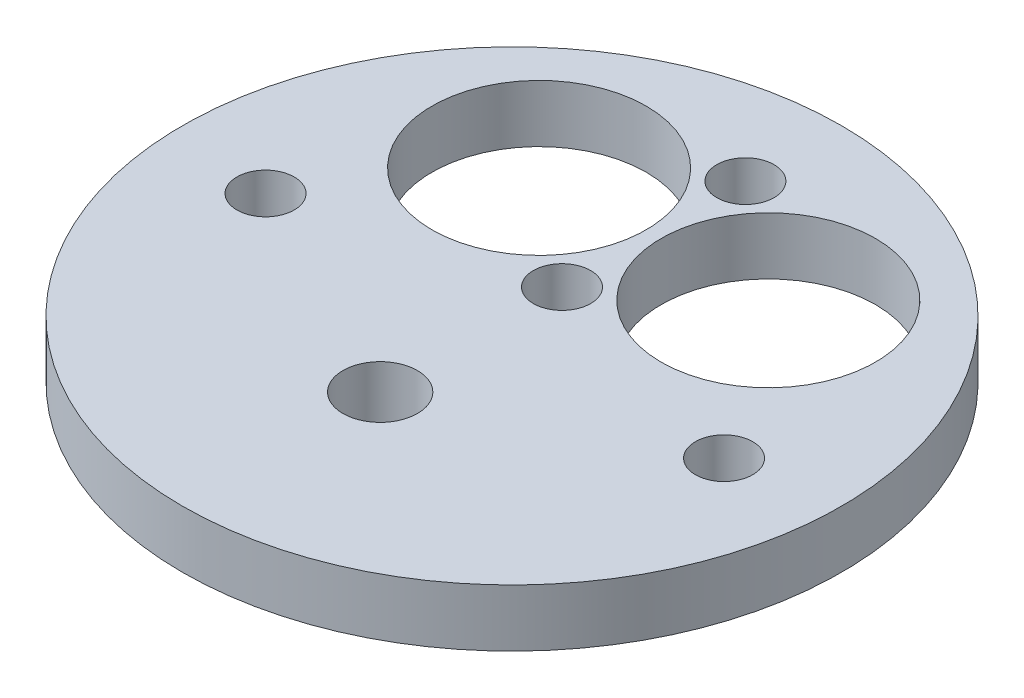
ISO-10303-21;
HEADER;
FILE_DESCRIPTION(('STEP AP214'),'2;1');
FILE_NAME('part.step','',(''),(''),'','','');
FILE_SCHEMA(('AUTOMOTIVE_DESIGN { 1 0 10303 214 1 1 1 1 }'));
ENDSEC;
DATA;
#1=APPLICATION_CONTEXT('core data for automotive mechanical design processes');
#2=APPLICATION_PROTOCOL_DEFINITION('international standard','automotive_design',2000,#1);
#3=PRODUCT_CONTEXT('',#1,'mechanical');
#4=PRODUCT('Part','Part','',(#3));
#5=PRODUCT_RELATED_PRODUCT_CATEGORY('part','',(#4));
#6=PRODUCT_DEFINITION_FORMATION('','',#4);
#7=PRODUCT_DEFINITION_CONTEXT('part definition',#1,'design');
#8=PRODUCT_DEFINITION('design','',#6,#7);
#9=PRODUCT_DEFINITION_SHAPE('','',#8);
#10=(LENGTH_UNIT() NAMED_UNIT(*) SI_UNIT(.MILLI.,.METRE.));
#11=(NAMED_UNIT(*) PLANE_ANGLE_UNIT() SI_UNIT($,.RADIAN.));
#12=(NAMED_UNIT(*) SI_UNIT($,.STERADIAN.) SOLID_ANGLE_UNIT());
#13=UNCERTAINTY_MEASURE_WITH_UNIT(LENGTH_MEASURE(1.E-05),#10,'distance_accuracy_value','');
#14=(GEOMETRIC_REPRESENTATION_CONTEXT(3) GLOBAL_UNCERTAINTY_ASSIGNED_CONTEXT((#13)) GLOBAL_UNIT_ASSIGNED_CONTEXT((#10,
#11,#12)) REPRESENTATION_CONTEXT('',''));
#15=CARTESIAN_POINT('',(0.,0.,0.));
#16=DIRECTION('',(0.,0.,1.));
#17=DIRECTION('',(1.,0.,0.));
#18=AXIS2_PLACEMENT_3D('',#15,#16,#17);
#19=CARTESIAN_POINT('',(0.,0.,0.));
#20=DIRECTION('',(0.,-1.,0.));
#21=DIRECTION('',(0.,0.,-1.));
#22=AXIS2_PLACEMENT_3D('',#19,#20,#21);
#23=PLANE('',#22);
#24=CARTESIAN_POINT('',(-25.4,0.,1.905));
#25=DIRECTION('',(0.,1.,0.));
#26=DIRECTION('',(0.,0.,1.));
#27=AXIS2_PLACEMENT_3D('',#24,#25,#26);
#28=CIRCLE('',#27,3.175);
#29=CARTESIAN_POINT('',(-25.4,0.,5.08));
#30=VERTEX_POINT('',#29);
#31=EDGE_CURVE('E120',#30,#30,#28,.T.);
#32=ORIENTED_EDGE('',*,*,#31,.T.);
#33=EDGE_LOOP('',(#32));
#34=FACE_BOUND('',#33,.T.);
#35=CARTESIAN_POINT('',(25.4,0.,1.90499999999999));
#36=DIRECTION('',(0.,1.,0.));
#37=DIRECTION('',(0.,0.,1.));
#38=AXIS2_PLACEMENT_3D('',#35,#36,#37);
#39=CIRCLE('',#38,3.175);
#40=CARTESIAN_POINT('',(25.4,0.,5.07999999999999));
#41=VERTEX_POINT('',#40);
#42=EDGE_CURVE('E124',#41,#41,#39,.T.);
#43=ORIENTED_EDGE('',*,*,#42,.T.);
#44=EDGE_LOOP('',(#43));
#45=FACE_BOUND('',#44,.T.);
#46=CARTESIAN_POINT('',(0.,0.,-25.85927542914));
#47=DIRECTION('',(0.,1.,0.));
#48=DIRECTION('',(0.,0.,1.));
#49=AXIS2_PLACEMENT_3D('',#46,#47,#48);
#50=CIRCLE('',#49,3.175);
#51=CARTESIAN_POINT('',(0.,0.,-22.68427542914));
#52=VERTEX_POINT('',#51);
#53=EDGE_CURVE('E137',#52,#52,#50,.T.);
#54=ORIENTED_EDGE('',*,*,#53,.T.);
#55=EDGE_LOOP('',(#54));
#56=FACE_BOUND('',#55,.T.);
#57=CARTESIAN_POINT('',(12.7,0.,-15.69927542914));
#58=DIRECTION('',(0.,1.,0.));
#59=DIRECTION('',(0.,0.,1.));
#60=AXIS2_PLACEMENT_3D('',#57,#58,#59);
#61=CIRCLE('',#60,11.8745);
#62=CARTESIAN_POINT('',(12.7,0.,-3.82477542914004));
#63=VERTEX_POINT('',#62);
#64=EDGE_CURVE('E142',#63,#63,#61,.T.);
#65=ORIENTED_EDGE('',*,*,#64,.T.);
#66=EDGE_LOOP('',(#65));
#67=FACE_BOUND('',#66,.T.);
#68=CARTESIAN_POINT('',(0.,0.,-5.53927542914004));
#69=DIRECTION('',(0.,1.,0.));
#70=DIRECTION('',(0.,0.,1.));
#71=AXIS2_PLACEMENT_3D('',#68,#69,#70);
#72=CIRCLE('',#71,3.175);
#73=CARTESIAN_POINT('',(0.,0.,-2.36427542914004));
#74=VERTEX_POINT('',#73);
#75=EDGE_CURVE('E134',#74,#74,#72,.T.);
#76=ORIENTED_EDGE('',*,*,#75,.T.);
#77=EDGE_LOOP('',(#76));
#78=FACE_BOUND('',#77,.T.);
#79=CARTESIAN_POINT('',(0.,0.,14.605));
#80=DIRECTION('',(0.,1.,0.));
#81=DIRECTION('',(0.,0.,1.));
#82=AXIS2_PLACEMENT_3D('',#79,#80,#81);
#83=CIRCLE('',#82,4.1275);
#84=CARTESIAN_POINT('',(0.,0.,18.7325));
#85=VERTEX_POINT('',#84);
#86=EDGE_CURVE('E126',#85,#85,#83,.T.);
#87=ORIENTED_EDGE('',*,*,#86,.T.);
#88=EDGE_LOOP('',(#87));
#89=FACE_BOUND('',#88,.T.);
#90=CARTESIAN_POINT('',(-12.7,0.,-15.69927542914));
#91=DIRECTION('',(0.,1.,0.));
#92=DIRECTION('',(0.,0.,1.));
#93=AXIS2_PLACEMENT_3D('',#90,#91,#92);
#94=CIRCLE('',#93,11.8745);
#95=CARTESIAN_POINT('',(-12.7,0.,-3.82477542914003));
#96=VERTEX_POINT('',#95);
#97=EDGE_CURVE('E54',#96,#96,#94,.T.);
#98=ORIENTED_EDGE('',*,*,#97,.T.);
#99=EDGE_LOOP('',(#98));
#100=FACE_BOUND('',#99,.T.);
#101=CARTESIAN_POINT('',(0.,0.,0.));
#102=DIRECTION('',(0.,-1.,0.));
#103=DIRECTION('',(0.,0.,-1.));
#104=AXIS2_PLACEMENT_3D('',#101,#102,#103);
#105=CIRCLE('',#104,36.5125);
#106=CARTESIAN_POINT('',(0.,0.,-36.5125));
#107=VERTEX_POINT('',#106);
#108=EDGE_CURVE('E10',#107,#107,#105,.T.);
#109=ORIENTED_EDGE('',*,*,#108,.T.);
#110=EDGE_LOOP('',(#109));
#111=FACE_BOUND('',#110,.T.);
#112=ADVANCED_FACE('F35',(#34,#45,#56,#67,#78,#89,#100,#111),#23,.T.);
#113=CARTESIAN_POINT('',(0.,0.,0.));
#114=DIRECTION('',(0.,-1.,0.));
#115=DIRECTION('',(0.,0.,-1.));
#116=AXIS2_PLACEMENT_3D('',#113,#114,#115);
#117=CYLINDRICAL_SURFACE('',#116,36.5125);
#118=CARTESIAN_POINT('',(0.,6.35,0.));
#119=DIRECTION('',(0.,-1.,0.));
#120=DIRECTION('',(0.,0.,-1.));
#121=AXIS2_PLACEMENT_3D('',#118,#119,#120);
#122=CIRCLE('',#121,36.5125);
#123=CARTESIAN_POINT('',(0.,6.35,-36.5125));
#124=VERTEX_POINT('',#123);
#125=EDGE_CURVE('E42',#124,#124,#122,.T.);
#126=ORIENTED_EDGE('',*,*,#125,.T.);
#127=EDGE_LOOP('',(#126));
#128=FACE_BOUND('',#127,.T.);
#129=ORIENTED_EDGE('',*,*,#108,.F.);
#130=EDGE_LOOP('',(#129));
#131=FACE_BOUND('',#130,.T.);
#132=ADVANCED_FACE('F73',(#128,#131),#117,.T.);
#133=CARTESIAN_POINT('',(36.5125,6.35,0.));
#134=DIRECTION('',(0.,1.,0.));
#135=DIRECTION('',(0.,0.,1.));
#136=AXIS2_PLACEMENT_3D('',#133,#134,#135);
#137=PLANE('',#136);
#138=CARTESIAN_POINT('',(-25.4,6.35,1.905));
#139=DIRECTION('',(0.,1.,0.));
#140=DIRECTION('',(0.,0.,1.));
#141=AXIS2_PLACEMENT_3D('',#138,#139,#140);
#142=CIRCLE('',#141,3.175);
#143=CARTESIAN_POINT('',(-25.4,6.35,5.08));
#144=VERTEX_POINT('',#143);
#145=EDGE_CURVE('E123',#144,#144,#142,.T.);
#146=ORIENTED_EDGE('',*,*,#145,.F.);
#147=EDGE_LOOP('',(#146));
#148=FACE_BOUND('',#147,.T.);
#149=CARTESIAN_POINT('',(25.4,6.35,1.90499999999999));
#150=DIRECTION('',(0.,1.,0.));
#151=DIRECTION('',(0.,0.,1.));
#152=AXIS2_PLACEMENT_3D('',#149,#150,#151);
#153=CIRCLE('',#152,3.175);
#154=CARTESIAN_POINT('',(25.4,6.35,5.07999999999999));
#155=VERTEX_POINT('',#154);
#156=EDGE_CURVE('E129',#155,#155,#153,.T.);
#157=ORIENTED_EDGE('',*,*,#156,.F.);
#158=EDGE_LOOP('',(#157));
#159=FACE_BOUND('',#158,.T.);
#160=CARTESIAN_POINT('',(0.,6.35,-25.85927542914));
#161=DIRECTION('',(0.,1.,0.));
#162=DIRECTION('',(0.,0.,1.));
#163=AXIS2_PLACEMENT_3D('',#160,#161,#162);
#164=CIRCLE('',#163,3.175);
#165=CARTESIAN_POINT('',(0.,6.35,-22.68427542914));
#166=VERTEX_POINT('',#165);
#167=EDGE_CURVE('E38',#166,#166,#164,.T.);
#168=ORIENTED_EDGE('',*,*,#167,.F.);
#169=EDGE_LOOP('',(#168));
#170=FACE_BOUND('',#169,.T.);
#171=CARTESIAN_POINT('',(12.7,6.35,-15.69927542914));
#172=DIRECTION('',(0.,1.,0.));
#173=DIRECTION('',(0.,0.,1.));
#174=AXIS2_PLACEMENT_3D('',#171,#172,#173);
#175=CIRCLE('',#174,11.8745);
#176=CARTESIAN_POINT('',(12.7,6.35,-3.82477542914004));
#177=VERTEX_POINT('',#176);
#178=EDGE_CURVE('E59',#177,#177,#175,.T.);
#179=ORIENTED_EDGE('',*,*,#178,.F.);
#180=EDGE_LOOP('',(#179));
#181=FACE_BOUND('',#180,.T.);
#182=CARTESIAN_POINT('',(0.,6.35,-5.53927542914004));
#183=DIRECTION('',(0.,1.,0.));
#184=DIRECTION('',(0.,0.,1.));
#185=AXIS2_PLACEMENT_3D('',#182,#183,#184);
#186=CIRCLE('',#185,3.175);
#187=CARTESIAN_POINT('',(0.,6.35,-2.36427542914004));
#188=VERTEX_POINT('',#187);
#189=EDGE_CURVE('E57',#188,#188,#186,.T.);
#190=ORIENTED_EDGE('',*,*,#189,.F.);
#191=EDGE_LOOP('',(#190));
#192=FACE_BOUND('',#191,.T.);
#193=CARTESIAN_POINT('',(0.,6.35,14.605));
#194=DIRECTION('',(0.,1.,0.));
#195=DIRECTION('',(0.,0.,1.));
#196=AXIS2_PLACEMENT_3D('',#193,#194,#195);
#197=CIRCLE('',#196,4.1275);
#198=CARTESIAN_POINT('',(0.,6.35,18.7325));
#199=VERTEX_POINT('',#198);
#200=EDGE_CURVE('E53',#199,#199,#197,.T.);
#201=ORIENTED_EDGE('',*,*,#200,.F.);
#202=EDGE_LOOP('',(#201));
#203=FACE_BOUND('',#202,.T.);
#204=CARTESIAN_POINT('',(-12.7,6.35,-15.69927542914));
#205=DIRECTION('',(0.,1.,0.));
#206=DIRECTION('',(0.,0.,1.));
#207=AXIS2_PLACEMENT_3D('',#204,#205,#206);
#208=CIRCLE('',#207,11.8745);
#209=CARTESIAN_POINT('',(-12.7,6.35,-3.82477542914003));
#210=VERTEX_POINT('',#209);
#211=EDGE_CURVE('E50',#210,#210,#208,.T.);
#212=ORIENTED_EDGE('',*,*,#211,.F.);
#213=EDGE_LOOP('',(#212));
#214=FACE_BOUND('',#213,.T.);
#215=ORIENTED_EDGE('',*,*,#125,.F.);
#216=EDGE_LOOP('',(#215));
#217=FACE_BOUND('',#216,.T.);
#218=ADVANCED_FACE('F69',(#148,#159,#170,#181,#192,#203,#214,#217),#137,.T.);
#219=CARTESIAN_POINT('',(-12.7,0.,-15.69927542914));
#220=DIRECTION('',(0.,1.,0.));
#221=DIRECTION('',(0.,0.,1.));
#222=AXIS2_PLACEMENT_3D('',#219,#220,#221);
#223=CYLINDRICAL_SURFACE('',#222,11.8745);
#224=CARTESIAN_POINT('',(-12.7,6.35,-3.82477542914003));
#225=CARTESIAN_POINT('',(-12.7,6.28385416666666,-3.82477542914003));
#226=CARTESIAN_POINT('',(-12.7,6.21770833333333,-3.82477542914003));
#227=CARTESIAN_POINT('',(-12.7,6.08541666666666,-3.82477542914003));
#228=CARTESIAN_POINT('',(-12.7,6.01927083333333,-3.82477542914003));
#229=CARTESIAN_POINT('',(-12.7,5.88697916666666,-3.82477542914003));
#230=CARTESIAN_POINT('',(-12.7,5.82083333333333,-3.82477542914003));
#231=CARTESIAN_POINT('',(-12.7,5.68854166666666,-3.82477542914003));
#232=CARTESIAN_POINT('',(-12.7,5.62239583333333,-3.82477542914003));
#233=CARTESIAN_POINT('',(-12.7,5.49010416666666,-3.82477542914003));
#234=CARTESIAN_POINT('',(-12.7,5.42395833333333,-3.82477542914003));
#235=CARTESIAN_POINT('',(-12.7,5.29166666666666,-3.82477542914003));
#236=CARTESIAN_POINT('',(-12.7,5.22552083333333,-3.82477542914003));
#237=CARTESIAN_POINT('',(-12.7,5.09322916666666,-3.82477542914003));
#238=CARTESIAN_POINT('',(-12.7,5.02708333333333,-3.82477542914003));
#239=CARTESIAN_POINT('',(-12.7,4.89479166666666,-3.82477542914003));
#240=CARTESIAN_POINT('',(-12.7,4.82864583333333,-3.82477542914003));
#241=CARTESIAN_POINT('',(-12.7,4.69635416666666,-3.82477542914003));
#242=CARTESIAN_POINT('',(-12.7,4.63020833333333,-3.82477542914003));
#243=CARTESIAN_POINT('',(-12.7,4.49791666666667,-3.82477542914003));
#244=CARTESIAN_POINT('',(-12.7,4.43177083333333,-3.82477542914003));
#245=CARTESIAN_POINT('',(-12.7,4.29947916666667,-3.82477542914003));
#246=CARTESIAN_POINT('',(-12.7,4.23333333333333,-3.82477542914003));
#247=CARTESIAN_POINT('',(-12.7,4.10104166666666,-3.82477542914003));
#248=CARTESIAN_POINT('',(-12.7,4.03489583333333,-3.82477542914003));
#249=CARTESIAN_POINT('',(-12.7,3.90260416666666,-3.82477542914003));
#250=CARTESIAN_POINT('',(-12.7,3.83645833333333,-3.82477542914003));
#251=CARTESIAN_POINT('',(-12.7,3.70416666666667,-3.82477542914003));
#252=CARTESIAN_POINT('',(-12.7,3.63802083333333,-3.82477542914003));
#253=CARTESIAN_POINT('',(-12.7,3.50572916666667,-3.82477542914003));
#254=CARTESIAN_POINT('',(-12.7,3.43958333333333,-3.82477542914003));
#255=CARTESIAN_POINT('',(-12.7,3.30729166666667,-3.82477542914003));
#256=CARTESIAN_POINT('',(-12.7,3.24114583333333,-3.82477542914003));
#257=CARTESIAN_POINT('',(-12.7,3.10885416666667,-3.82477542914003));
#258=CARTESIAN_POINT('',(-12.7,3.04270833333333,-3.82477542914003));
#259=CARTESIAN_POINT('',(-12.7,2.91041666666667,-3.82477542914003));
#260=CARTESIAN_POINT('',(-12.7,2.84427083333333,-3.82477542914003));
#261=CARTESIAN_POINT('',(-12.7,2.71197916666667,-3.82477542914003));
#262=CARTESIAN_POINT('',(-12.7,2.64583333333333,-3.82477542914003));
#263=CARTESIAN_POINT('',(-12.7,2.51354166666667,-3.82477542914003));
#264=CARTESIAN_POINT('',(-12.7,2.44739583333333,-3.82477542914003));
#265=CARTESIAN_POINT('',(-12.7,2.31510416666667,-3.82477542914003));
#266=CARTESIAN_POINT('',(-12.7,2.24895833333333,-3.82477542914003));
#267=CARTESIAN_POINT('',(-12.7,2.11666666666666,-3.82477542914003));
#268=CARTESIAN_POINT('',(-12.7,2.05052083333333,-3.82477542914003));
#269=CARTESIAN_POINT('',(-12.7,1.91822916666667,-3.82477542914003));
#270=CARTESIAN_POINT('',(-12.7,1.85208333333333,-3.82477542914003));
#271=CARTESIAN_POINT('',(-12.7,1.71979166666667,-3.82477542914003));
#272=CARTESIAN_POINT('',(-12.7,1.65364583333333,-3.82477542914003));
#273=CARTESIAN_POINT('',(-12.7,1.52135416666667,-3.82477542914003));
#274=CARTESIAN_POINT('',(-12.7,1.45520833333333,-3.82477542914003));
#275=CARTESIAN_POINT('',(-12.7,1.32291666666667,-3.82477542914003));
#276=CARTESIAN_POINT('',(-12.7,1.25677083333333,-3.82477542914003));
#277=CARTESIAN_POINT('',(-12.7,1.12447916666667,-3.82477542914003));
#278=CARTESIAN_POINT('',(-12.7,1.05833333333333,-3.82477542914003));
#279=CARTESIAN_POINT('',(-12.7,0.926041666666666,-3.82477542914003));
#280=CARTESIAN_POINT('',(-12.7,0.859895833333333,-3.82477542914003));
#281=CARTESIAN_POINT('',(-12.7,0.727604166666666,-3.82477542914003));
#282=CARTESIAN_POINT('',(-12.7,0.661458333333333,-3.82477542914003));
#283=CARTESIAN_POINT('',(-12.7,0.529166666666666,-3.82477542914003));
#284=CARTESIAN_POINT('',(-12.7,0.463020833333333,-3.82477542914003));
#285=CARTESIAN_POINT('',(-12.7,0.330729166666666,-3.82477542914003));
#286=CARTESIAN_POINT('',(-12.7,0.264583333333333,-3.82477542914003));
#287=CARTESIAN_POINT('',(-12.7,0.132291666666667,-3.82477542914003));
#288=CARTESIAN_POINT('',(-12.7,0.0661458333333333,-3.82477542914003));
#289=CARTESIAN_POINT('',(-12.7,0.,-3.82477542914003));
#290=B_SPLINE_CURVE_WITH_KNOTS('',3,(#224,#225,#226,#227,#228,#229,#230,#231,#232,#233,#234,
#235,#236,#237,#238,#239,#240,#241,#242,#243,#244,#245,#246,#247,#248,#249,#250,#251,#252,#253,
#254,#255,#256,#257,#258,#259,#260,#261,#262,#263,#264,#265,#266,#267,#268,#269,#270,#271,#272,
#273,#274,#275,#276,#277,#278,#279,#280,#281,#282,#283,#284,#285,#286,#287,#288,#289),
.UNSPECIFIED.,.F.,.F.,(4,2,2,2,2,2,2,2,2,2,2,2,2,2,2,2,2,2,2,2,2,2,2,2,2,2,2,2,2,2,2,2,4),(0.,
0.1984375,0.396875,0.595312499999999,0.793749999999999,0.9921875,1.190625,1.3890625,1.5875,
1.7859375,1.984375,2.1828125,2.38125,2.5796875,2.778125,2.9765625,3.175,3.3734375,3.571875,
3.7703125,3.96875,4.1671875,4.365625,4.5640625,4.7625,4.9609375,5.159375,5.3578125,5.55625,
5.7546875,5.953125,6.1515625,6.35),.UNSPECIFIED.);
#291=EDGE_CURVE('BSEAM72',#210,#96,#290,.T.);
#292=ORIENTED_EDGE('',*,*,#211,.T.);
#293=ORIENTED_EDGE('',*,*,#97,.F.);
#294=ORIENTED_EDGE('',*,*,#291,.T.);
#295=ORIENTED_EDGE('',*,*,#291,.F.);
#296=EDGE_LOOP('',(#292,#294,#293,#295));
#297=FACE_BOUND('',#296,.T.);
#298=ADVANCED_FACE('F72',(#297),#223,.F.);
#299=CARTESIAN_POINT('',(0.,0.,14.605));
#300=DIRECTION('',(0.,1.,0.));
#301=DIRECTION('',(0.,0.,1.));
#302=AXIS2_PLACEMENT_3D('',#299,#300,#301);
#303=CYLINDRICAL_SURFACE('',#302,4.1275);
#304=CARTESIAN_POINT('',(0.,6.35,18.7325));
#305=CARTESIAN_POINT('',(0.,6.28385416666666,18.7325));
#306=CARTESIAN_POINT('',(0.,6.21770833333333,18.7325));
#307=CARTESIAN_POINT('',(0.,6.08541666666666,18.7325));
#308=CARTESIAN_POINT('',(0.,6.01927083333333,18.7325));
#309=CARTESIAN_POINT('',(0.,5.88697916666666,18.7325));
#310=CARTESIAN_POINT('',(0.,5.82083333333333,18.7325));
#311=CARTESIAN_POINT('',(0.,5.68854166666666,18.7325));
#312=CARTESIAN_POINT('',(0.,5.62239583333333,18.7325));
#313=CARTESIAN_POINT('',(0.,5.49010416666666,18.7325));
#314=CARTESIAN_POINT('',(0.,5.42395833333333,18.7325));
#315=CARTESIAN_POINT('',(0.,5.29166666666666,18.7325));
#316=CARTESIAN_POINT('',(0.,5.22552083333333,18.7325));
#317=CARTESIAN_POINT('',(0.,5.09322916666666,18.7325));
#318=CARTESIAN_POINT('',(0.,5.02708333333333,18.7325));
#319=CARTESIAN_POINT('',(0.,4.89479166666666,18.7325));
#320=CARTESIAN_POINT('',(0.,4.82864583333333,18.7325));
#321=CARTESIAN_POINT('',(0.,4.69635416666666,18.7325));
#322=CARTESIAN_POINT('',(0.,4.63020833333333,18.7325));
#323=CARTESIAN_POINT('',(0.,4.49791666666667,18.7325));
#324=CARTESIAN_POINT('',(0.,4.43177083333333,18.7325));
#325=CARTESIAN_POINT('',(0.,4.29947916666667,18.7325));
#326=CARTESIAN_POINT('',(0.,4.23333333333333,18.7325));
#327=CARTESIAN_POINT('',(0.,4.10104166666666,18.7325));
#328=CARTESIAN_POINT('',(0.,4.03489583333333,18.7325));
#329=CARTESIAN_POINT('',(0.,3.90260416666666,18.7325));
#330=CARTESIAN_POINT('',(0.,3.83645833333333,18.7325));
#331=CARTESIAN_POINT('',(0.,3.70416666666667,18.7325));
#332=CARTESIAN_POINT('',(0.,3.63802083333333,18.7325));
#333=CARTESIAN_POINT('',(0.,3.50572916666667,18.7325));
#334=CARTESIAN_POINT('',(0.,3.43958333333333,18.7325));
#335=CARTESIAN_POINT('',(0.,3.30729166666667,18.7325));
#336=CARTESIAN_POINT('',(0.,3.24114583333333,18.7325));
#337=CARTESIAN_POINT('',(0.,3.10885416666667,18.7325));
#338=CARTESIAN_POINT('',(0.,3.04270833333333,18.7325));
#339=CARTESIAN_POINT('',(0.,2.91041666666667,18.7325));
#340=CARTESIAN_POINT('',(0.,2.84427083333333,18.7325));
#341=CARTESIAN_POINT('',(0.,2.71197916666667,18.7325));
#342=CARTESIAN_POINT('',(0.,2.64583333333333,18.7325));
#343=CARTESIAN_POINT('',(0.,2.51354166666667,18.7325));
#344=CARTESIAN_POINT('',(0.,2.44739583333333,18.7325));
#345=CARTESIAN_POINT('',(0.,2.31510416666667,18.7325));
#346=CARTESIAN_POINT('',(0.,2.24895833333333,18.7325));
#347=CARTESIAN_POINT('',(0.,2.11666666666666,18.7325));
#348=CARTESIAN_POINT('',(0.,2.05052083333333,18.7325));
#349=CARTESIAN_POINT('',(0.,1.91822916666667,18.7325));
#350=CARTESIAN_POINT('',(0.,1.85208333333333,18.7325));
#351=CARTESIAN_POINT('',(0.,1.71979166666667,18.7325));
#352=CARTESIAN_POINT('',(0.,1.65364583333333,18.7325));
#353=CARTESIAN_POINT('',(0.,1.52135416666667,18.7325));
#354=CARTESIAN_POINT('',(0.,1.45520833333333,18.7325));
#355=CARTESIAN_POINT('',(0.,1.32291666666667,18.7325));
#356=CARTESIAN_POINT('',(0.,1.25677083333333,18.7325));
#357=CARTESIAN_POINT('',(0.,1.12447916666667,18.7325));
#358=CARTESIAN_POINT('',(0.,1.05833333333333,18.7325));
#359=CARTESIAN_POINT('',(0.,0.926041666666666,18.7325));
#360=CARTESIAN_POINT('',(0.,0.859895833333333,18.7325));
#361=CARTESIAN_POINT('',(0.,0.727604166666666,18.7325));
#362=CARTESIAN_POINT('',(0.,0.661458333333333,18.7325));
#363=CARTESIAN_POINT('',(0.,0.529166666666666,18.7325));
#364=CARTESIAN_POINT('',(0.,0.463020833333333,18.7325));
#365=CARTESIAN_POINT('',(0.,0.330729166666666,18.7325));
#366=CARTESIAN_POINT('',(0.,0.264583333333333,18.7325));
#367=CARTESIAN_POINT('',(0.,0.132291666666667,18.7325));
#368=CARTESIAN_POINT('',(0.,0.0661458333333333,18.7325));
#369=CARTESIAN_POINT('',(0.,0.,18.7325));
#370=B_SPLINE_CURVE_WITH_KNOTS('',3,(#304,#305,#306,#307,#308,#309,#310,#311,#312,#313,#314,
#315,#316,#317,#318,#319,#320,#321,#322,#323,#324,#325,#326,#327,#328,#329,#330,#331,#332,#333,
#334,#335,#336,#337,#338,#339,#340,#341,#342,#343,#344,#345,#346,#347,#348,#349,#350,#351,#352,
#353,#354,#355,#356,#357,#358,#359,#360,#361,#362,#363,#364,#365,#366,#367,#368,#369),
.UNSPECIFIED.,.F.,.F.,(4,2,2,2,2,2,2,2,2,2,2,2,2,2,2,2,2,2,2,2,2,2,2,2,2,2,2,2,2,2,2,2,4),(0.,
0.1984375,0.396875,0.595312499999999,0.793749999999999,0.9921875,1.190625,1.3890625,1.5875,
1.7859375,1.984375,2.1828125,2.38125,2.5796875,2.778125,2.9765625,3.175,3.3734375,3.571875,
3.7703125,3.96875,4.1671875,4.365625,4.5640625,4.7625,4.9609375,5.159375,5.3578125,5.55625,
5.7546875,5.953125,6.1515625,6.35),.UNSPECIFIED.);
#371=EDGE_CURVE('BSEAM94',#199,#85,#370,.T.);
#372=ORIENTED_EDGE('',*,*,#200,.T.);
#373=ORIENTED_EDGE('',*,*,#86,.F.);
#374=ORIENTED_EDGE('',*,*,#371,.T.);
#375=ORIENTED_EDGE('',*,*,#371,.F.);
#376=EDGE_LOOP('',(#372,#374,#373,#375));
#377=FACE_BOUND('',#376,.T.);
#378=ADVANCED_FACE('F94',(#377),#303,.F.);
#379=CARTESIAN_POINT('',(0.,0.,-5.53927542914004));
#380=DIRECTION('',(0.,1.,0.));
#381=DIRECTION('',(0.,0.,1.));
#382=AXIS2_PLACEMENT_3D('',#379,#380,#381);
#383=CYLINDRICAL_SURFACE('',#382,3.175);
#384=CARTESIAN_POINT('',(0.,6.35,-2.36427542914004));
#385=CARTESIAN_POINT('',(0.,6.28385416666666,-2.36427542914004));
#386=CARTESIAN_POINT('',(0.,6.21770833333333,-2.36427542914004));
#387=CARTESIAN_POINT('',(0.,6.08541666666666,-2.36427542914004));
#388=CARTESIAN_POINT('',(0.,6.01927083333333,-2.36427542914004));
#389=CARTESIAN_POINT('',(0.,5.88697916666666,-2.36427542914004));
#390=CARTESIAN_POINT('',(0.,5.82083333333333,-2.36427542914004));
#391=CARTESIAN_POINT('',(0.,5.68854166666666,-2.36427542914004));
#392=CARTESIAN_POINT('',(0.,5.62239583333333,-2.36427542914004));
#393=CARTESIAN_POINT('',(0.,5.49010416666666,-2.36427542914004));
#394=CARTESIAN_POINT('',(0.,5.42395833333333,-2.36427542914004));
#395=CARTESIAN_POINT('',(0.,5.29166666666666,-2.36427542914004));
#396=CARTESIAN_POINT('',(0.,5.22552083333333,-2.36427542914004));
#397=CARTESIAN_POINT('',(0.,5.09322916666666,-2.36427542914004));
#398=CARTESIAN_POINT('',(0.,5.02708333333333,-2.36427542914004));
#399=CARTESIAN_POINT('',(0.,4.89479166666666,-2.36427542914004));
#400=CARTESIAN_POINT('',(0.,4.82864583333333,-2.36427542914004));
#401=CARTESIAN_POINT('',(0.,4.69635416666666,-2.36427542914004));
#402=CARTESIAN_POINT('',(0.,4.63020833333333,-2.36427542914004));
#403=CARTESIAN_POINT('',(0.,4.49791666666667,-2.36427542914004));
#404=CARTESIAN_POINT('',(0.,4.43177083333333,-2.36427542914004));
#405=CARTESIAN_POINT('',(0.,4.29947916666667,-2.36427542914004));
#406=CARTESIAN_POINT('',(0.,4.23333333333333,-2.36427542914004));
#407=CARTESIAN_POINT('',(0.,4.10104166666666,-2.36427542914004));
#408=CARTESIAN_POINT('',(0.,4.03489583333333,-2.36427542914004));
#409=CARTESIAN_POINT('',(0.,3.90260416666666,-2.36427542914004));
#410=CARTESIAN_POINT('',(0.,3.83645833333333,-2.36427542914004));
#411=CARTESIAN_POINT('',(0.,3.70416666666667,-2.36427542914004));
#412=CARTESIAN_POINT('',(0.,3.63802083333333,-2.36427542914004));
#413=CARTESIAN_POINT('',(0.,3.50572916666667,-2.36427542914004));
#414=CARTESIAN_POINT('',(0.,3.43958333333333,-2.36427542914004));
#415=CARTESIAN_POINT('',(0.,3.30729166666667,-2.36427542914004));
#416=CARTESIAN_POINT('',(0.,3.24114583333333,-2.36427542914004));
#417=CARTESIAN_POINT('',(0.,3.10885416666667,-2.36427542914004));
#418=CARTESIAN_POINT('',(0.,3.04270833333333,-2.36427542914004));
#419=CARTESIAN_POINT('',(0.,2.91041666666667,-2.36427542914004));
#420=CARTESIAN_POINT('',(0.,2.84427083333333,-2.36427542914004));
#421=CARTESIAN_POINT('',(0.,2.71197916666667,-2.36427542914004));
#422=CARTESIAN_POINT('',(0.,2.64583333333333,-2.36427542914004));
#423=CARTESIAN_POINT('',(0.,2.51354166666667,-2.36427542914004));
#424=CARTESIAN_POINT('',(0.,2.44739583333333,-2.36427542914004));
#425=CARTESIAN_POINT('',(0.,2.31510416666667,-2.36427542914004));
#426=CARTESIAN_POINT('',(0.,2.24895833333333,-2.36427542914004));
#427=CARTESIAN_POINT('',(0.,2.11666666666666,-2.36427542914004));
#428=CARTESIAN_POINT('',(0.,2.05052083333333,-2.36427542914004));
#429=CARTESIAN_POINT('',(0.,1.91822916666667,-2.36427542914004));
#430=CARTESIAN_POINT('',(0.,1.85208333333333,-2.36427542914004));
#431=CARTESIAN_POINT('',(0.,1.71979166666667,-2.36427542914004));
#432=CARTESIAN_POINT('',(0.,1.65364583333333,-2.36427542914004));
#433=CARTESIAN_POINT('',(0.,1.52135416666667,-2.36427542914004));
#434=CARTESIAN_POINT('',(0.,1.45520833333333,-2.36427542914004));
#435=CARTESIAN_POINT('',(0.,1.32291666666667,-2.36427542914004));
#436=CARTESIAN_POINT('',(0.,1.25677083333333,-2.36427542914004));
#437=CARTESIAN_POINT('',(0.,1.12447916666667,-2.36427542914004));
#438=CARTESIAN_POINT('',(0.,1.05833333333333,-2.36427542914004));
#439=CARTESIAN_POINT('',(0.,0.926041666666666,-2.36427542914004));
#440=CARTESIAN_POINT('',(0.,0.859895833333333,-2.36427542914004));
#441=CARTESIAN_POINT('',(0.,0.727604166666666,-2.36427542914004));
#442=CARTESIAN_POINT('',(0.,0.661458333333333,-2.36427542914004));
#443=CARTESIAN_POINT('',(0.,0.529166666666666,-2.36427542914004));
#444=CARTESIAN_POINT('',(0.,0.463020833333333,-2.36427542914004));
#445=CARTESIAN_POINT('',(0.,0.330729166666666,-2.36427542914004));
#446=CARTESIAN_POINT('',(0.,0.264583333333333,-2.36427542914004));
#447=CARTESIAN_POINT('',(0.,0.132291666666667,-2.36427542914004));
#448=CARTESIAN_POINT('',(0.,0.0661458333333333,-2.36427542914004));
#449=CARTESIAN_POINT('',(0.,0.,-2.36427542914004));
#450=B_SPLINE_CURVE_WITH_KNOTS('',3,(#384,#385,#386,#387,#388,#389,#390,#391,#392,#393,#394,
#395,#396,#397,#398,#399,#400,#401,#402,#403,#404,#405,#406,#407,#408,#409,#410,#411,#412,#413,
#414,#415,#416,#417,#418,#419,#420,#421,#422,#423,#424,#425,#426,#427,#428,#429,#430,#431,#432,
#433,#434,#435,#436,#437,#438,#439,#440,#441,#442,#443,#444,#445,#446,#447,#448,#449),
.UNSPECIFIED.,.F.,.F.,(4,2,2,2,2,2,2,2,2,2,2,2,2,2,2,2,2,2,2,2,2,2,2,2,2,2,2,2,2,2,2,2,4),(0.,
0.1984375,0.396875,0.595312499999999,0.793749999999999,0.9921875,1.190625,1.3890625,1.5875,
1.7859375,1.984375,2.1828125,2.38125,2.5796875,2.778125,2.9765625,3.175,3.3734375,3.571875,
3.7703125,3.96875,4.1671875,4.365625,4.5640625,4.7625,4.9609375,5.159375,5.3578125,5.55625,
5.7546875,5.953125,6.1515625,6.35),.UNSPECIFIED.);
#451=EDGE_CURVE('BSEAM99',#188,#74,#450,.T.);
#452=ORIENTED_EDGE('',*,*,#189,.T.);
#453=ORIENTED_EDGE('',*,*,#75,.F.);
#454=ORIENTED_EDGE('',*,*,#451,.T.);
#455=ORIENTED_EDGE('',*,*,#451,.F.);
#456=EDGE_LOOP('',(#452,#454,#453,#455));
#457=FACE_BOUND('',#456,.T.);
#458=ADVANCED_FACE('F99',(#457),#383,.F.);
#459=CARTESIAN_POINT('',(12.7,0.,-15.69927542914));
#460=DIRECTION('',(0.,1.,0.));
#461=DIRECTION('',(0.,0.,1.));
#462=AXIS2_PLACEMENT_3D('',#459,#460,#461);
#463=CYLINDRICAL_SURFACE('',#462,11.8745);
#464=CARTESIAN_POINT('',(12.7,6.35,-3.82477542914004));
#465=CARTESIAN_POINT('',(12.7,6.28385416666666,-3.82477542914004));
#466=CARTESIAN_POINT('',(12.7,6.21770833333333,-3.82477542914004));
#467=CARTESIAN_POINT('',(12.7,6.08541666666666,-3.82477542914004));
#468=CARTESIAN_POINT('',(12.7,6.01927083333333,-3.82477542914004));
#469=CARTESIAN_POINT('',(12.7,5.88697916666666,-3.82477542914004));
#470=CARTESIAN_POINT('',(12.7,5.82083333333333,-3.82477542914004));
#471=CARTESIAN_POINT('',(12.7,5.68854166666666,-3.82477542914004));
#472=CARTESIAN_POINT('',(12.7,5.62239583333333,-3.82477542914004));
#473=CARTESIAN_POINT('',(12.7,5.49010416666666,-3.82477542914004));
#474=CARTESIAN_POINT('',(12.7,5.42395833333333,-3.82477542914004));
#475=CARTESIAN_POINT('',(12.7,5.29166666666666,-3.82477542914004));
#476=CARTESIAN_POINT('',(12.7,5.22552083333333,-3.82477542914004));
#477=CARTESIAN_POINT('',(12.7,5.09322916666666,-3.82477542914004));
#478=CARTESIAN_POINT('',(12.7,5.02708333333333,-3.82477542914004));
#479=CARTESIAN_POINT('',(12.7,4.89479166666666,-3.82477542914004));
#480=CARTESIAN_POINT('',(12.7,4.82864583333333,-3.82477542914004));
#481=CARTESIAN_POINT('',(12.7,4.69635416666666,-3.82477542914004));
#482=CARTESIAN_POINT('',(12.7,4.63020833333333,-3.82477542914004));
#483=CARTESIAN_POINT('',(12.7,4.49791666666667,-3.82477542914004));
#484=CARTESIAN_POINT('',(12.7,4.43177083333333,-3.82477542914004));
#485=CARTESIAN_POINT('',(12.7,4.29947916666667,-3.82477542914004));
#486=CARTESIAN_POINT('',(12.7,4.23333333333333,-3.82477542914004));
#487=CARTESIAN_POINT('',(12.7,4.10104166666666,-3.82477542914004));
#488=CARTESIAN_POINT('',(12.7,4.03489583333333,-3.82477542914004));
#489=CARTESIAN_POINT('',(12.7,3.90260416666666,-3.82477542914004));
#490=CARTESIAN_POINT('',(12.7,3.83645833333333,-3.82477542914004));
#491=CARTESIAN_POINT('',(12.7,3.70416666666667,-3.82477542914004));
#492=CARTESIAN_POINT('',(12.7,3.63802083333333,-3.82477542914004));
#493=CARTESIAN_POINT('',(12.7,3.50572916666667,-3.82477542914004));
#494=CARTESIAN_POINT('',(12.7,3.43958333333333,-3.82477542914004));
#495=CARTESIAN_POINT('',(12.7,3.30729166666667,-3.82477542914004));
#496=CARTESIAN_POINT('',(12.7,3.24114583333333,-3.82477542914004));
#497=CARTESIAN_POINT('',(12.7,3.10885416666667,-3.82477542914004));
#498=CARTESIAN_POINT('',(12.7,3.04270833333333,-3.82477542914004));
#499=CARTESIAN_POINT('',(12.7,2.91041666666667,-3.82477542914004));
#500=CARTESIAN_POINT('',(12.7,2.84427083333333,-3.82477542914004));
#501=CARTESIAN_POINT('',(12.7,2.71197916666667,-3.82477542914004));
#502=CARTESIAN_POINT('',(12.7,2.64583333333333,-3.82477542914004));
#503=CARTESIAN_POINT('',(12.7,2.51354166666667,-3.82477542914004));
#504=CARTESIAN_POINT('',(12.7,2.44739583333333,-3.82477542914004));
#505=CARTESIAN_POINT('',(12.7,2.31510416666667,-3.82477542914004));
#506=CARTESIAN_POINT('',(12.7,2.24895833333333,-3.82477542914004));
#507=CARTESIAN_POINT('',(12.7,2.11666666666666,-3.82477542914004));
#508=CARTESIAN_POINT('',(12.7,2.05052083333333,-3.82477542914004));
#509=CARTESIAN_POINT('',(12.7,1.91822916666667,-3.82477542914004));
#510=CARTESIAN_POINT('',(12.7,1.85208333333333,-3.82477542914004));
#511=CARTESIAN_POINT('',(12.7,1.71979166666667,-3.82477542914004));
#512=CARTESIAN_POINT('',(12.7,1.65364583333333,-3.82477542914004));
#513=CARTESIAN_POINT('',(12.7,1.52135416666667,-3.82477542914004));
#514=CARTESIAN_POINT('',(12.7,1.45520833333333,-3.82477542914004));
#515=CARTESIAN_POINT('',(12.7,1.32291666666667,-3.82477542914004));
#516=CARTESIAN_POINT('',(12.7,1.25677083333333,-3.82477542914004));
#517=CARTESIAN_POINT('',(12.7,1.12447916666667,-3.82477542914004));
#518=CARTESIAN_POINT('',(12.7,1.05833333333333,-3.82477542914004));
#519=CARTESIAN_POINT('',(12.7,0.926041666666666,-3.82477542914004));
#520=CARTESIAN_POINT('',(12.7,0.859895833333333,-3.82477542914004));
#521=CARTESIAN_POINT('',(12.7,0.727604166666666,-3.82477542914004));
#522=CARTESIAN_POINT('',(12.7,0.661458333333333,-3.82477542914004));
#523=CARTESIAN_POINT('',(12.7,0.529166666666666,-3.82477542914004));
#524=CARTESIAN_POINT('',(12.7,0.463020833333333,-3.82477542914004));
#525=CARTESIAN_POINT('',(12.7,0.330729166666666,-3.82477542914004));
#526=CARTESIAN_POINT('',(12.7,0.264583333333333,-3.82477542914004));
#527=CARTESIAN_POINT('',(12.7,0.132291666666667,-3.82477542914004));
#528=CARTESIAN_POINT('',(12.7,0.0661458333333333,-3.82477542914004));
#529=CARTESIAN_POINT('',(12.7,0.,-3.82477542914004));
#530=B_SPLINE_CURVE_WITH_KNOTS('',3,(#464,#465,#466,#467,#468,#469,#470,#471,#472,#473,#474,
#475,#476,#477,#478,#479,#480,#481,#482,#483,#484,#485,#486,#487,#488,#489,#490,#491,#492,#493,
#494,#495,#496,#497,#498,#499,#500,#501,#502,#503,#504,#505,#506,#507,#508,#509,#510,#511,#512,
#513,#514,#515,#516,#517,#518,#519,#520,#521,#522,#523,#524,#525,#526,#527,#528,#529),
.UNSPECIFIED.,.F.,.F.,(4,2,2,2,2,2,2,2,2,2,2,2,2,2,2,2,2,2,2,2,2,2,2,2,2,2,2,2,2,2,2,2,4),(0.,
0.1984375,0.396875,0.595312499999999,0.793749999999999,0.9921875,1.190625,1.3890625,1.5875,
1.7859375,1.984375,2.1828125,2.38125,2.5796875,2.778125,2.9765625,3.175,3.3734375,3.571875,
3.7703125,3.96875,4.1671875,4.365625,4.5640625,4.7625,4.9609375,5.159375,5.3578125,5.55625,
5.7546875,5.953125,6.1515625,6.35),.UNSPECIFIED.);
#531=EDGE_CURVE('BSEAM96',#177,#63,#530,.T.);
#532=ORIENTED_EDGE('',*,*,#178,.T.);
#533=ORIENTED_EDGE('',*,*,#64,.F.);
#534=ORIENTED_EDGE('',*,*,#531,.T.);
#535=ORIENTED_EDGE('',*,*,#531,.F.);
#536=EDGE_LOOP('',(#532,#534,#533,#535));
#537=FACE_BOUND('',#536,.T.);
#538=ADVANCED_FACE('F96',(#537),#463,.F.);
#539=CARTESIAN_POINT('',(0.,0.,-25.85927542914));
#540=DIRECTION('',(0.,1.,0.));
#541=DIRECTION('',(0.,0.,1.));
#542=AXIS2_PLACEMENT_3D('',#539,#540,#541);
#543=CYLINDRICAL_SURFACE('',#542,3.175);
#544=CARTESIAN_POINT('',(0.,6.35,-22.68427542914));
#545=CARTESIAN_POINT('',(0.,6.28385416666666,-22.68427542914));
#546=CARTESIAN_POINT('',(0.,6.21770833333333,-22.68427542914));
#547=CARTESIAN_POINT('',(0.,6.08541666666666,-22.68427542914));
#548=CARTESIAN_POINT('',(0.,6.01927083333333,-22.68427542914));
#549=CARTESIAN_POINT('',(0.,5.88697916666666,-22.68427542914));
#550=CARTESIAN_POINT('',(0.,5.82083333333333,-22.68427542914));
#551=CARTESIAN_POINT('',(0.,5.68854166666666,-22.68427542914));
#552=CARTESIAN_POINT('',(0.,5.62239583333333,-22.68427542914));
#553=CARTESIAN_POINT('',(0.,5.49010416666666,-22.68427542914));
#554=CARTESIAN_POINT('',(0.,5.42395833333333,-22.68427542914));
#555=CARTESIAN_POINT('',(0.,5.29166666666666,-22.68427542914));
#556=CARTESIAN_POINT('',(0.,5.22552083333333,-22.68427542914));
#557=CARTESIAN_POINT('',(0.,5.09322916666666,-22.68427542914));
#558=CARTESIAN_POINT('',(0.,5.02708333333333,-22.68427542914));
#559=CARTESIAN_POINT('',(0.,4.89479166666666,-22.68427542914));
#560=CARTESIAN_POINT('',(0.,4.82864583333333,-22.68427542914));
#561=CARTESIAN_POINT('',(0.,4.69635416666666,-22.68427542914));
#562=CARTESIAN_POINT('',(0.,4.63020833333333,-22.68427542914));
#563=CARTESIAN_POINT('',(0.,4.49791666666667,-22.68427542914));
#564=CARTESIAN_POINT('',(0.,4.43177083333333,-22.68427542914));
#565=CARTESIAN_POINT('',(0.,4.29947916666667,-22.68427542914));
#566=CARTESIAN_POINT('',(0.,4.23333333333333,-22.68427542914));
#567=CARTESIAN_POINT('',(0.,4.10104166666666,-22.68427542914));
#568=CARTESIAN_POINT('',(0.,4.03489583333333,-22.68427542914));
#569=CARTESIAN_POINT('',(0.,3.90260416666666,-22.68427542914));
#570=CARTESIAN_POINT('',(0.,3.83645833333333,-22.68427542914));
#571=CARTESIAN_POINT('',(0.,3.70416666666667,-22.68427542914));
#572=CARTESIAN_POINT('',(0.,3.63802083333333,-22.68427542914));
#573=CARTESIAN_POINT('',(0.,3.50572916666667,-22.68427542914));
#574=CARTESIAN_POINT('',(0.,3.43958333333333,-22.68427542914));
#575=CARTESIAN_POINT('',(0.,3.30729166666667,-22.68427542914));
#576=CARTESIAN_POINT('',(0.,3.24114583333333,-22.68427542914));
#577=CARTESIAN_POINT('',(0.,3.10885416666667,-22.68427542914));
#578=CARTESIAN_POINT('',(0.,3.04270833333333,-22.68427542914));
#579=CARTESIAN_POINT('',(0.,2.91041666666667,-22.68427542914));
#580=CARTESIAN_POINT('',(0.,2.84427083333333,-22.68427542914));
#581=CARTESIAN_POINT('',(0.,2.71197916666667,-22.68427542914));
#582=CARTESIAN_POINT('',(0.,2.64583333333333,-22.68427542914));
#583=CARTESIAN_POINT('',(0.,2.51354166666667,-22.68427542914));
#584=CARTESIAN_POINT('',(0.,2.44739583333333,-22.68427542914));
#585=CARTESIAN_POINT('',(0.,2.31510416666667,-22.68427542914));
#586=CARTESIAN_POINT('',(0.,2.24895833333333,-22.68427542914));
#587=CARTESIAN_POINT('',(0.,2.11666666666666,-22.68427542914));
#588=CARTESIAN_POINT('',(0.,2.05052083333333,-22.68427542914));
#589=CARTESIAN_POINT('',(0.,1.91822916666667,-22.68427542914));
#590=CARTESIAN_POINT('',(0.,1.85208333333333,-22.68427542914));
#591=CARTESIAN_POINT('',(0.,1.71979166666667,-22.68427542914));
#592=CARTESIAN_POINT('',(0.,1.65364583333333,-22.68427542914));
#593=CARTESIAN_POINT('',(0.,1.52135416666667,-22.68427542914));
#594=CARTESIAN_POINT('',(0.,1.45520833333333,-22.68427542914));
#595=CARTESIAN_POINT('',(0.,1.32291666666667,-22.68427542914));
#596=CARTESIAN_POINT('',(0.,1.25677083333333,-22.68427542914));
#597=CARTESIAN_POINT('',(0.,1.12447916666667,-22.68427542914));
#598=CARTESIAN_POINT('',(0.,1.05833333333333,-22.68427542914));
#599=CARTESIAN_POINT('',(0.,0.926041666666666,-22.68427542914));
#600=CARTESIAN_POINT('',(0.,0.859895833333333,-22.68427542914));
#601=CARTESIAN_POINT('',(0.,0.727604166666666,-22.68427542914));
#602=CARTESIAN_POINT('',(0.,0.661458333333333,-22.68427542914));
#603=CARTESIAN_POINT('',(0.,0.529166666666666,-22.68427542914));
#604=CARTESIAN_POINT('',(0.,0.463020833333333,-22.68427542914));
#605=CARTESIAN_POINT('',(0.,0.330729166666666,-22.68427542914));
#606=CARTESIAN_POINT('',(0.,0.264583333333333,-22.68427542914));
#607=CARTESIAN_POINT('',(0.,0.132291666666667,-22.68427542914));
#608=CARTESIAN_POINT('',(0.,0.0661458333333333,-22.68427542914));
#609=CARTESIAN_POINT('',(0.,0.,-22.68427542914));
#610=B_SPLINE_CURVE_WITH_KNOTS('',3,(#544,#545,#546,#547,#548,#549,#550,#551,#552,#553,#554,
#555,#556,#557,#558,#559,#560,#561,#562,#563,#564,#565,#566,#567,#568,#569,#570,#571,#572,#573,
#574,#575,#576,#577,#578,#579,#580,#581,#582,#583,#584,#585,#586,#587,#588,#589,#590,#591,#592,
#593,#594,#595,#596,#597,#598,#599,#600,#601,#602,#603,#604,#605,#606,#607,#608,#609),
.UNSPECIFIED.,.F.,.F.,(4,2,2,2,2,2,2,2,2,2,2,2,2,2,2,2,2,2,2,2,2,2,2,2,2,2,2,2,2,2,2,2,4),(0.,
0.1984375,0.396875,0.595312499999999,0.793749999999999,0.9921875,1.190625,1.3890625,1.5875,
1.7859375,1.984375,2.1828125,2.38125,2.5796875,2.778125,2.9765625,3.175,3.3734375,3.571875,
3.7703125,3.96875,4.1671875,4.365625,4.5640625,4.7625,4.9609375,5.159375,5.3578125,5.55625,
5.7546875,5.953125,6.1515625,6.35),.UNSPECIFIED.);
#611=EDGE_CURVE('BSEAM66',#166,#52,#610,.T.);
#612=ORIENTED_EDGE('',*,*,#167,.T.);
#613=ORIENTED_EDGE('',*,*,#53,.F.);
#614=ORIENTED_EDGE('',*,*,#611,.T.);
#615=ORIENTED_EDGE('',*,*,#611,.F.);
#616=EDGE_LOOP('',(#612,#614,#613,#615));
#617=FACE_BOUND('',#616,.T.);
#618=ADVANCED_FACE('F66',(#617),#543,.F.);
#619=CARTESIAN_POINT('',(25.4,0.,1.90499999999999));
#620=DIRECTION('',(0.,1.,0.));
#621=DIRECTION('',(0.,0.,1.));
#622=AXIS2_PLACEMENT_3D('',#619,#620,#621);
#623=CYLINDRICAL_SURFACE('',#622,3.175);
#624=CARTESIAN_POINT('',(25.4,0.,5.07999999999999));
#625=CARTESIAN_POINT('',(25.4,0.0661458333333332,5.07999999999999));
#626=CARTESIAN_POINT('',(25.4,0.132291666666667,5.07999999999999));
#627=CARTESIAN_POINT('',(25.4,0.264583333333333,5.07999999999999));
#628=CARTESIAN_POINT('',(25.4,0.330729166666667,5.07999999999999));
#629=CARTESIAN_POINT('',(25.4,0.463020833333333,5.07999999999999));
#630=CARTESIAN_POINT('',(25.4,0.529166666666666,5.07999999999999));
#631=CARTESIAN_POINT('',(25.4,0.661458333333333,5.07999999999999));
#632=CARTESIAN_POINT('',(25.4,0.727604166666666,5.07999999999999));
#633=CARTESIAN_POINT('',(25.4,0.859895833333333,5.07999999999999));
#634=CARTESIAN_POINT('',(25.4,0.926041666666666,5.07999999999999));
#635=CARTESIAN_POINT('',(25.4,1.05833333333333,5.07999999999999));
#636=CARTESIAN_POINT('',(25.4,1.12447916666667,5.07999999999999));
#637=CARTESIAN_POINT('',(25.4,1.25677083333333,5.07999999999999));
#638=CARTESIAN_POINT('',(25.4,1.32291666666667,5.07999999999999));
#639=CARTESIAN_POINT('',(25.4,1.45520833333333,5.07999999999999));
#640=CARTESIAN_POINT('',(25.4,1.52135416666667,5.07999999999999));
#641=CARTESIAN_POINT('',(25.4,1.65364583333333,5.07999999999999));
#642=CARTESIAN_POINT('',(25.4,1.71979166666667,5.07999999999999));
#643=CARTESIAN_POINT('',(25.4,1.85208333333333,5.07999999999999));
#644=CARTESIAN_POINT('',(25.4,1.91822916666667,5.07999999999999));
#645=CARTESIAN_POINT('',(25.4,2.05052083333333,5.07999999999999));
#646=CARTESIAN_POINT('',(25.4,2.11666666666667,5.07999999999999));
#647=CARTESIAN_POINT('',(25.4,2.24895833333333,5.07999999999999));
#648=CARTESIAN_POINT('',(25.4,2.31510416666667,5.07999999999999));
#649=CARTESIAN_POINT('',(25.4,2.44739583333333,5.07999999999999));
#650=CARTESIAN_POINT('',(25.4,2.51354166666667,5.07999999999999));
#651=CARTESIAN_POINT('',(25.4,2.64583333333333,5.07999999999999));
#652=CARTESIAN_POINT('',(25.4,2.71197916666667,5.07999999999999));
#653=CARTESIAN_POINT('',(25.4,2.84427083333333,5.07999999999999));
#654=CARTESIAN_POINT('',(25.4,2.91041666666667,5.07999999999999));
#655=CARTESIAN_POINT('',(25.4,3.04270833333333,5.07999999999999));
#656=CARTESIAN_POINT('',(25.4,3.10885416666667,5.07999999999999));
#657=CARTESIAN_POINT('',(25.4,3.24114583333333,5.07999999999999));
#658=CARTESIAN_POINT('',(25.4,3.30729166666667,5.07999999999999));
#659=CARTESIAN_POINT('',(25.4,3.43958333333333,5.07999999999999));
#660=CARTESIAN_POINT('',(25.4,3.50572916666667,5.07999999999999));
#661=CARTESIAN_POINT('',(25.4,3.63802083333333,5.07999999999999));
#662=CARTESIAN_POINT('',(25.4,3.70416666666667,5.07999999999999));
#663=CARTESIAN_POINT('',(25.4,3.83645833333333,5.07999999999999));
#664=CARTESIAN_POINT('',(25.4,3.90260416666666,5.07999999999999));
#665=CARTESIAN_POINT('',(25.4,4.03489583333333,5.07999999999999));
#666=CARTESIAN_POINT('',(25.4,4.10104166666666,5.07999999999999));
#667=CARTESIAN_POINT('',(25.4,4.23333333333333,5.07999999999999));
#668=CARTESIAN_POINT('',(25.4,4.29947916666667,5.07999999999999));
#669=CARTESIAN_POINT('',(25.4,4.43177083333333,5.07999999999999));
#670=CARTESIAN_POINT('',(25.4,4.49791666666667,5.07999999999999));
#671=CARTESIAN_POINT('',(25.4,4.63020833333333,5.07999999999999));
#672=CARTESIAN_POINT('',(25.4,4.69635416666666,5.07999999999999));
#673=CARTESIAN_POINT('',(25.4,4.82864583333333,5.07999999999999));
#674=CARTESIAN_POINT('',(25.4,4.89479166666666,5.07999999999999));
#675=CARTESIAN_POINT('',(25.4,5.02708333333333,5.07999999999999));
#676=CARTESIAN_POINT('',(25.4,5.09322916666666,5.07999999999999));
#677=CARTESIAN_POINT('',(25.4,5.22552083333333,5.07999999999999));
#678=CARTESIAN_POINT('',(25.4,5.29166666666666,5.07999999999999));
#679=CARTESIAN_POINT('',(25.4,5.42395833333333,5.07999999999999));
#680=CARTESIAN_POINT('',(25.4,5.49010416666666,5.07999999999999));
#681=CARTESIAN_POINT('',(25.4,5.62239583333333,5.07999999999999));
#682=CARTESIAN_POINT('',(25.4,5.68854166666666,5.07999999999999));
#683=CARTESIAN_POINT('',(25.4,5.82083333333333,5.07999999999999));
#684=CARTESIAN_POINT('',(25.4,5.88697916666666,5.07999999999999));
#685=CARTESIAN_POINT('',(25.4,6.01927083333333,5.07999999999999));
#686=CARTESIAN_POINT('',(25.4,6.08541666666666,5.07999999999999));
#687=CARTESIAN_POINT('',(25.4,6.21770833333333,5.07999999999999));
#688=CARTESIAN_POINT('',(25.4,6.28385416666666,5.07999999999999));
#689=CARTESIAN_POINT('',(25.4,6.35,5.07999999999999));
#690=B_SPLINE_CURVE_WITH_KNOTS('',3,(#624,#625,#626,#627,#628,#629,#630,#631,#632,#633,#634,
#635,#636,#637,#638,#639,#640,#641,#642,#643,#644,#645,#646,#647,#648,#649,#650,#651,#652,#653,
#654,#655,#656,#657,#658,#659,#660,#661,#662,#663,#664,#665,#666,#667,#668,#669,#670,#671,#672,
#673,#674,#675,#676,#677,#678,#679,#680,#681,#682,#683,#684,#685,#686,#687,#688,#689),
.UNSPECIFIED.,.F.,.F.,(4,2,2,2,2,2,2,2,2,2,2,2,2,2,2,2,2,2,2,2,2,2,2,2,2,2,2,2,2,2,2,2,4),(0.,
0.1984375,0.396875,0.5953125,0.79375,0.992187499999999,1.190625,1.3890625,1.5875,1.7859375,
1.984375,2.1828125,2.38125,2.5796875,2.778125,2.9765625,3.175,3.3734375,3.571875,3.7703125,
3.96875,4.1671875,4.365625,4.5640625,4.7625,4.9609375,5.159375,5.3578125,5.55625,5.7546875,
5.953125,6.1515625,6.35),.UNSPECIFIED.);
#691=EDGE_CURVE('BSEAM102',#41,#155,#690,.T.);
#692=ORIENTED_EDGE('',*,*,#42,.F.);
#693=ORIENTED_EDGE('',*,*,#156,.T.);
#694=ORIENTED_EDGE('',*,*,#691,.T.);
#695=ORIENTED_EDGE('',*,*,#691,.F.);
#696=EDGE_LOOP('',(#692,#694,#693,#695));
#697=FACE_BOUND('',#696,.T.);
#698=ADVANCED_FACE('F102',(#697),#623,.F.);
#699=CARTESIAN_POINT('',(-25.4,0.,1.905));
#700=DIRECTION('',(0.,1.,0.));
#701=DIRECTION('',(0.,0.,1.));
#702=AXIS2_PLACEMENT_3D('',#699,#700,#701);
#703=CYLINDRICAL_SURFACE('',#702,3.175);
#704=CARTESIAN_POINT('',(-25.4,0.,5.08));
#705=CARTESIAN_POINT('',(-25.4,0.0661458333333332,5.08));
#706=CARTESIAN_POINT('',(-25.4,0.132291666666667,5.08));
#707=CARTESIAN_POINT('',(-25.4,0.264583333333333,5.08));
#708=CARTESIAN_POINT('',(-25.4,0.330729166666667,5.08));
#709=CARTESIAN_POINT('',(-25.4,0.463020833333333,5.08));
#710=CARTESIAN_POINT('',(-25.4,0.529166666666666,5.08));
#711=CARTESIAN_POINT('',(-25.4,0.661458333333333,5.08));
#712=CARTESIAN_POINT('',(-25.4,0.727604166666666,5.08));
#713=CARTESIAN_POINT('',(-25.4,0.859895833333333,5.08));
#714=CARTESIAN_POINT('',(-25.4,0.926041666666666,5.08));
#715=CARTESIAN_POINT('',(-25.4,1.05833333333333,5.08));
#716=CARTESIAN_POINT('',(-25.4,1.12447916666667,5.08));
#717=CARTESIAN_POINT('',(-25.4,1.25677083333333,5.08));
#718=CARTESIAN_POINT('',(-25.4,1.32291666666667,5.08));
#719=CARTESIAN_POINT('',(-25.4,1.45520833333333,5.08));
#720=CARTESIAN_POINT('',(-25.4,1.52135416666667,5.08));
#721=CARTESIAN_POINT('',(-25.4,1.65364583333333,5.08));
#722=CARTESIAN_POINT('',(-25.4,1.71979166666667,5.08));
#723=CARTESIAN_POINT('',(-25.4,1.85208333333333,5.08));
#724=CARTESIAN_POINT('',(-25.4,1.91822916666667,5.08));
#725=CARTESIAN_POINT('',(-25.4,2.05052083333333,5.08));
#726=CARTESIAN_POINT('',(-25.4,2.11666666666667,5.08));
#727=CARTESIAN_POINT('',(-25.4,2.24895833333333,5.08));
#728=CARTESIAN_POINT('',(-25.4,2.31510416666667,5.08));
#729=CARTESIAN_POINT('',(-25.4,2.44739583333333,5.08));
#730=CARTESIAN_POINT('',(-25.4,2.51354166666667,5.08));
#731=CARTESIAN_POINT('',(-25.4,2.64583333333333,5.08));
#732=CARTESIAN_POINT('',(-25.4,2.71197916666667,5.08));
#733=CARTESIAN_POINT('',(-25.4,2.84427083333333,5.08));
#734=CARTESIAN_POINT('',(-25.4,2.91041666666667,5.08));
#735=CARTESIAN_POINT('',(-25.4,3.04270833333333,5.08));
#736=CARTESIAN_POINT('',(-25.4,3.10885416666667,5.08));
#737=CARTESIAN_POINT('',(-25.4,3.24114583333333,5.08));
#738=CARTESIAN_POINT('',(-25.4,3.30729166666667,5.08));
#739=CARTESIAN_POINT('',(-25.4,3.43958333333333,5.08));
#740=CARTESIAN_POINT('',(-25.4,3.50572916666667,5.08));
#741=CARTESIAN_POINT('',(-25.4,3.63802083333333,5.08));
#742=CARTESIAN_POINT('',(-25.4,3.70416666666667,5.08));
#743=CARTESIAN_POINT('',(-25.4,3.83645833333333,5.08));
#744=CARTESIAN_POINT('',(-25.4,3.90260416666666,5.08));
#745=CARTESIAN_POINT('',(-25.4,4.03489583333333,5.08));
#746=CARTESIAN_POINT('',(-25.4,4.10104166666666,5.08));
#747=CARTESIAN_POINT('',(-25.4,4.23333333333333,5.08));
#748=CARTESIAN_POINT('',(-25.4,4.29947916666667,5.08));
#749=CARTESIAN_POINT('',(-25.4,4.43177083333333,5.08));
#750=CARTESIAN_POINT('',(-25.4,4.49791666666667,5.08));
#751=CARTESIAN_POINT('',(-25.4,4.63020833333333,5.08));
#752=CARTESIAN_POINT('',(-25.4,4.69635416666666,5.08));
#753=CARTESIAN_POINT('',(-25.4,4.82864583333333,5.08));
#754=CARTESIAN_POINT('',(-25.4,4.89479166666666,5.08));
#755=CARTESIAN_POINT('',(-25.4,5.02708333333333,5.08));
#756=CARTESIAN_POINT('',(-25.4,5.09322916666666,5.08));
#757=CARTESIAN_POINT('',(-25.4,5.22552083333333,5.08));
#758=CARTESIAN_POINT('',(-25.4,5.29166666666666,5.08));
#759=CARTESIAN_POINT('',(-25.4,5.42395833333333,5.08));
#760=CARTESIAN_POINT('',(-25.4,5.49010416666666,5.08));
#761=CARTESIAN_POINT('',(-25.4,5.62239583333333,5.08));
#762=CARTESIAN_POINT('',(-25.4,5.68854166666666,5.08));
#763=CARTESIAN_POINT('',(-25.4,5.82083333333333,5.08));
#764=CARTESIAN_POINT('',(-25.4,5.88697916666666,5.08));
#765=CARTESIAN_POINT('',(-25.4,6.01927083333333,5.08));
#766=CARTESIAN_POINT('',(-25.4,6.08541666666666,5.08));
#767=CARTESIAN_POINT('',(-25.4,6.21770833333333,5.08));
#768=CARTESIAN_POINT('',(-25.4,6.28385416666666,5.08));
#769=CARTESIAN_POINT('',(-25.4,6.35,5.08));
#770=B_SPLINE_CURVE_WITH_KNOTS('',3,(#704,#705,#706,#707,#708,#709,#710,#711,#712,#713,#714,
#715,#716,#717,#718,#719,#720,#721,#722,#723,#724,#725,#726,#727,#728,#729,#730,#731,#732,#733,
#734,#735,#736,#737,#738,#739,#740,#741,#742,#743,#744,#745,#746,#747,#748,#749,#750,#751,#752,
#753,#754,#755,#756,#757,#758,#759,#760,#761,#762,#763,#764,#765,#766,#767,#768,#769),
.UNSPECIFIED.,.F.,.F.,(4,2,2,2,2,2,2,2,2,2,2,2,2,2,2,2,2,2,2,2,2,2,2,2,2,2,2,2,2,2,2,2,4),(0.,
0.1984375,0.396875,0.5953125,0.79375,0.992187499999999,1.190625,1.3890625,1.5875,1.7859375,
1.984375,2.1828125,2.38125,2.5796875,2.778125,2.9765625,3.175,3.3734375,3.571875,3.7703125,
3.96875,4.1671875,4.365625,4.5640625,4.7625,4.9609375,5.159375,5.3578125,5.55625,5.7546875,
5.953125,6.1515625,6.35),.UNSPECIFIED.);
#771=EDGE_CURVE('BSEAM111',#30,#144,#770,.T.);
#772=ORIENTED_EDGE('',*,*,#31,.F.);
#773=ORIENTED_EDGE('',*,*,#145,.T.);
#774=ORIENTED_EDGE('',*,*,#771,.T.);
#775=ORIENTED_EDGE('',*,*,#771,.F.);
#776=EDGE_LOOP('',(#772,#774,#773,#775));
#777=FACE_BOUND('',#776,.T.);
#778=ADVANCED_FACE('F111',(#777),#703,.F.);
#779=CLOSED_SHELL('',(#112,#132,#218,#298,#378,#458,#538,#618,#698,#778));
#780=MANIFOLD_SOLID_BREP('B2',#779);
#781=ADVANCED_BREP_SHAPE_REPRESENTATION('',(#18,#780),#14);
#782=SHAPE_DEFINITION_REPRESENTATION(#9,#781);
ENDSEC;
END-ISO-10303-21;
